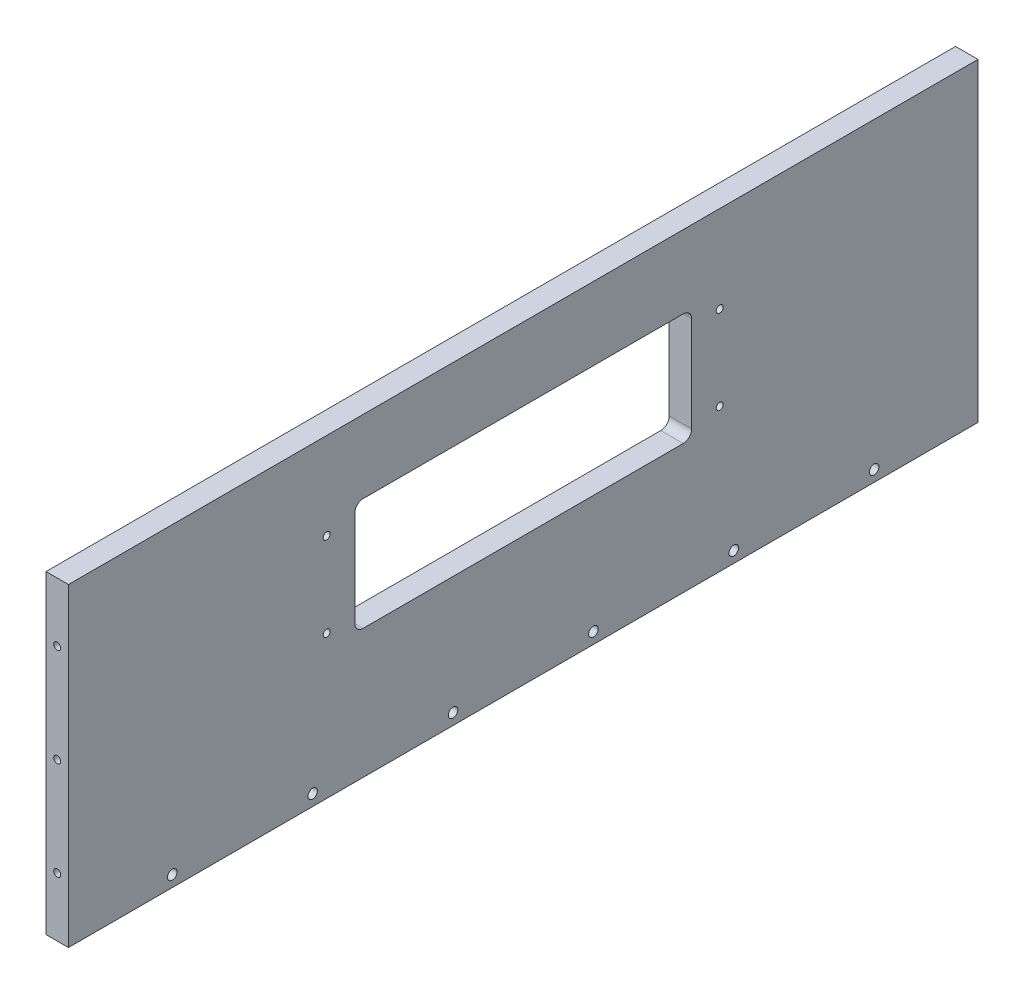
ISO-10303-21;
HEADER;
FILE_DESCRIPTION(('STEP AP214'),'2;1');
FILE_NAME('part.step','',(''),(''),'','','');
FILE_SCHEMA(('AUTOMOTIVE_DESIGN { 1 0 10303 214 1 1 1 1 }'));
ENDSEC;
DATA;
#1=APPLICATION_CONTEXT('core data for automotive mechanical design processes');
#2=APPLICATION_PROTOCOL_DEFINITION('international standard','automotive_design',2000,#1);
#3=PRODUCT_CONTEXT('',#1,'mechanical');
#4=PRODUCT('Part','Part','',(#3));
#5=PRODUCT_RELATED_PRODUCT_CATEGORY('part','',(#4));
#6=PRODUCT_DEFINITION_FORMATION('','',#4);
#7=PRODUCT_DEFINITION_CONTEXT('part definition',#1,'design');
#8=PRODUCT_DEFINITION('design','',#6,#7);
#9=PRODUCT_DEFINITION_SHAPE('','',#8);
#10=(LENGTH_UNIT() NAMED_UNIT(*) SI_UNIT(.MILLI.,.METRE.));
#11=(NAMED_UNIT(*) PLANE_ANGLE_UNIT() SI_UNIT($,.RADIAN.));
#12=(NAMED_UNIT(*) SI_UNIT($,.STERADIAN.) SOLID_ANGLE_UNIT());
#13=UNCERTAINTY_MEASURE_WITH_UNIT(LENGTH_MEASURE(1.E-05),#10,'distance_accuracy_value','');
#14=(GEOMETRIC_REPRESENTATION_CONTEXT(3) GLOBAL_UNCERTAINTY_ASSIGNED_CONTEXT((#13)) GLOBAL_UNIT_ASSIGNED_CONTEXT((#10,
#11,#12)) REPRESENTATION_CONTEXT('',''));
#15=CARTESIAN_POINT('',(0.,0.,0.));
#16=DIRECTION('',(0.,0.,1.));
#17=DIRECTION('',(1.,0.,0.));
#18=AXIS2_PLACEMENT_3D('',#15,#16,#17);
#19=CARTESIAN_POINT('',(0.,0.,0.));
#20=DIRECTION('',(1.,0.,0.));
#21=DIRECTION('',(0.,0.,-1.));
#22=AXIS2_PLACEMENT_3D('',#19,#20,#21);
#23=PLANE('',#22);
#24=CARTESIAN_POINT('',(0.,-5.00000000000001,70.));
#25=DIRECTION('',(-1.,0.,0.));
#26=DIRECTION('',(0.,0.,1.));
#27=AXIS2_PLACEMENT_3D('',#24,#25,#26);
#28=CIRCLE('',#27,1.25);
#29=CARTESIAN_POINT('',(0.,-5.00000000000001,71.25));
#30=VERTEX_POINT('',#29);
#31=EDGE_CURVE('E385',#30,#30,#28,.T.);
#32=ORIENTED_EDGE('',*,*,#31,.F.);
#33=EDGE_LOOP('',(#32));
#34=FACE_BOUND('',#33,.T.);
#35=CARTESIAN_POINT('',(0.,25.,-70.));
#36=DIRECTION('',(-1.,0.,0.));
#37=DIRECTION('',(0.,0.,1.));
#38=AXIS2_PLACEMENT_3D('',#35,#36,#37);
#39=CIRCLE('',#38,1.25);
#40=CARTESIAN_POINT('',(0.,25.,-68.75));
#41=VERTEX_POINT('',#40);
#42=EDGE_CURVE('E393',#41,#41,#39,.T.);
#43=ORIENTED_EDGE('',*,*,#42,.F.);
#44=EDGE_LOOP('',(#43));
#45=FACE_BOUND('',#44,.T.);
#46=DIRECTION('',(0.,0.,1.));
#47=VECTOR('',#46,1.);
#48=CARTESIAN_POINT('',(0.,-10.,60.));
#49=LINE('',#48,#47);
#50=CARTESIAN_POINT('',(0.,-10.,-57.));
#51=VERTEX_POINT('',#50);
#52=CARTESIAN_POINT('',(0.,-10.,57.));
#53=VERTEX_POINT('',#52);
#54=EDGE_CURVE('E327',#51,#53,#49,.T.);
#55=ORIENTED_EDGE('',*,*,#54,.F.);
#56=CARTESIAN_POINT('',(0.,-7.00000000000001,-57.));
#57=DIRECTION('',(1.,0.,0.));
#58=DIRECTION('',(0.,0.,-1.));
#59=AXIS2_PLACEMENT_3D('',#56,#57,#58);
#60=CIRCLE('',#59,3.);
#61=CARTESIAN_POINT('',(0.,-7.00000000000001,-60.));
#62=VERTEX_POINT('',#61);
#63=EDGE_CURVE('E279',#51,#62,#60,.T.);
#64=ORIENTED_EDGE('',*,*,#63,.T.);
#65=DIRECTION('',(0.,-1.,0.));
#66=VECTOR('',#65,1.);
#67=CARTESIAN_POINT('',(0.,-10.,-60.));
#68=LINE('',#67,#66);
#69=CARTESIAN_POINT('',(0.,27.,-60.));
#70=VERTEX_POINT('',#69);
#71=EDGE_CURVE('E296',#70,#62,#68,.T.);
#72=ORIENTED_EDGE('',*,*,#71,.F.);
#73=CARTESIAN_POINT('',(0.,27.,-57.));
#74=DIRECTION('',(1.,0.,0.));
#75=DIRECTION('',(0.,0.,-1.));
#76=AXIS2_PLACEMENT_3D('',#73,#74,#75);
#77=CIRCLE('',#76,3.);
#78=CARTESIAN_POINT('',(0.,30.,-57.));
#79=VERTEX_POINT('',#78);
#80=EDGE_CURVE('E57',#70,#79,#77,.T.);
#81=ORIENTED_EDGE('',*,*,#80,.T.);
#82=DIRECTION('',(0.,0.,-1.));
#83=VECTOR('',#82,1.);
#84=CARTESIAN_POINT('',(0.,30.,60.));
#85=LINE('',#84,#83);
#86=CARTESIAN_POINT('',(0.,30.,57.));
#87=VERTEX_POINT('',#86);
#88=EDGE_CURVE('E294',#87,#79,#85,.T.);
#89=ORIENTED_EDGE('',*,*,#88,.F.);
#90=CARTESIAN_POINT('',(0.,27.,57.));
#91=DIRECTION('',(1.,0.,0.));
#92=DIRECTION('',(0.,0.,-1.));
#93=AXIS2_PLACEMENT_3D('',#90,#91,#92);
#94=CIRCLE('',#93,3.);
#95=CARTESIAN_POINT('',(0.,27.,60.));
#96=VERTEX_POINT('',#95);
#97=EDGE_CURVE('E287',#87,#96,#94,.T.);
#98=ORIENTED_EDGE('',*,*,#97,.T.);
#99=DIRECTION('',(0.,1.,0.));
#100=VECTOR('',#99,1.);
#101=CARTESIAN_POINT('',(0.,-10.,60.));
#102=LINE('',#101,#100);
#103=CARTESIAN_POINT('',(0.,-7.,60.));
#104=VERTEX_POINT('',#103);
#105=EDGE_CURVE('E302',#104,#96,#102,.T.);
#106=ORIENTED_EDGE('',*,*,#105,.F.);
#107=CARTESIAN_POINT('',(0.,-7.,57.));
#108=DIRECTION('',(1.,0.,0.));
#109=DIRECTION('',(0.,0.,-1.));
#110=AXIS2_PLACEMENT_3D('',#107,#108,#109);
#111=CIRCLE('',#110,3.);
#112=EDGE_CURVE('E283',#104,#53,#111,.T.);
#113=ORIENTED_EDGE('',*,*,#112,.T.);
#114=EDGE_LOOP('',(#55,#64,#72,#81,#89,#98,#106,#113));
#115=FACE_BOUND('',#114,.T.);
#116=CARTESIAN_POINT('',(0.,-52.,-125.));
#117=DIRECTION('',(-1.,0.,0.));
#118=DIRECTION('',(0.,0.,1.));
#119=AXIS2_PLACEMENT_3D('',#116,#117,#118);
#120=CIRCLE('',#119,3.15);
#121=CARTESIAN_POINT('',(0.,-52.,-121.85));
#122=VERTEX_POINT('',#121);
#123=EDGE_CURVE('E325',#122,#122,#120,.T.);
#124=ORIENTED_EDGE('',*,*,#123,.F.);
#125=EDGE_LOOP('',(#124));
#126=FACE_BOUND('',#125,.T.);
#127=CARTESIAN_POINT('',(0.,-52.,-75.));
#128=DIRECTION('',(-1.,0.,0.));
#129=DIRECTION('',(0.,0.,1.));
#130=AXIS2_PLACEMENT_3D('',#127,#128,#129);
#131=CIRCLE('',#130,3.15);
#132=CARTESIAN_POINT('',(0.,-52.,-71.85));
#133=VERTEX_POINT('',#132);
#134=EDGE_CURVE('E259',#133,#133,#131,.T.);
#135=ORIENTED_EDGE('',*,*,#134,.F.);
#136=EDGE_LOOP('',(#135));
#137=FACE_BOUND('',#136,.T.);
#138=CARTESIAN_POINT('',(0.,-52.,-25.));
#139=DIRECTION('',(-1.,0.,0.));
#140=DIRECTION('',(0.,0.,1.));
#141=AXIS2_PLACEMENT_3D('',#138,#139,#140);
#142=CIRCLE('',#141,3.15);
#143=CARTESIAN_POINT('',(0.,-52.,-21.85));
#144=VERTEX_POINT('',#143);
#145=EDGE_CURVE('E254',#144,#144,#142,.T.);
#146=ORIENTED_EDGE('',*,*,#145,.F.);
#147=EDGE_LOOP('',(#146));
#148=FACE_BOUND('',#147,.T.);
#149=CARTESIAN_POINT('',(0.,-51.9999999999999,75.));
#150=DIRECTION('',(-1.,0.,0.));
#151=DIRECTION('',(0.,0.,1.));
#152=AXIS2_PLACEMENT_3D('',#149,#150,#151);
#153=CIRCLE('',#152,3.15);
#154=CARTESIAN_POINT('',(0.,-51.9999999999999,78.15));
#155=VERTEX_POINT('',#154);
#156=EDGE_CURVE('E244',#155,#155,#153,.T.);
#157=ORIENTED_EDGE('',*,*,#156,.F.);
#158=EDGE_LOOP('',(#157));
#159=FACE_BOUND('',#158,.T.);
#160=CARTESIAN_POINT('',(0.,-51.9999999999999,125.));
#161=DIRECTION('',(-1.,0.,0.));
#162=DIRECTION('',(0.,0.,1.));
#163=AXIS2_PLACEMENT_3D('',#160,#161,#162);
#164=CIRCLE('',#163,3.15);
#165=CARTESIAN_POINT('',(0.,-51.9999999999999,128.15));
#166=VERTEX_POINT('',#165);
#167=EDGE_CURVE('E239',#166,#166,#164,.T.);
#168=ORIENTED_EDGE('',*,*,#167,.F.);
#169=EDGE_LOOP('',(#168));
#170=FACE_BOUND('',#169,.T.);
#171=DIRECTION('',(0.,-1.,0.));
#172=VECTOR('',#171,1.);
#173=CARTESIAN_POINT('',(0.,-56.,162.));
#174=LINE('',#173,#172);
#175=CARTESIAN_POINT('',(0.,56.,162.));
#176=VERTEX_POINT('',#175);
#177=CARTESIAN_POINT('',(0.,-56.,162.));
#178=VERTEX_POINT('',#177);
#179=EDGE_CURVE('E202',#176,#178,#174,.T.);
#180=ORIENTED_EDGE('',*,*,#179,.F.);
#181=DIRECTION('',(0.,0.,1.));
#182=VECTOR('',#181,1.);
#183=CARTESIAN_POINT('',(0.,56.,-162.));
#184=LINE('',#183,#182);
#185=CARTESIAN_POINT('',(0.,56.,-162.));
#186=VERTEX_POINT('',#185);
#187=EDGE_CURVE('E207',#186,#176,#184,.T.);
#188=ORIENTED_EDGE('',*,*,#187,.F.);
#189=DIRECTION('',(0.,1.,0.));
#190=VECTOR('',#189,1.);
#191=CARTESIAN_POINT('',(0.,-56.,-162.));
#192=LINE('',#191,#190);
#193=CARTESIAN_POINT('',(0.,-56.,-162.));
#194=VERTEX_POINT('',#193);
#195=EDGE_CURVE('E218',#194,#186,#192,.T.);
#196=ORIENTED_EDGE('',*,*,#195,.F.);
#197=DIRECTION('',(0.,0.,-1.));
#198=VECTOR('',#197,1.);
#199=CARTESIAN_POINT('',(0.,-56.,-162.));
#200=LINE('',#199,#198);
#201=EDGE_CURVE('E216',#178,#194,#200,.T.);
#202=ORIENTED_EDGE('',*,*,#201,.F.);
#203=EDGE_LOOP('',(#180,#188,#196,#202));
#204=FACE_BOUND('',#203,.T.);
#205=CARTESIAN_POINT('',(0.,-52.,25.));
#206=DIRECTION('',(-1.,0.,0.));
#207=DIRECTION('',(0.,0.,1.));
#208=AXIS2_PLACEMENT_3D('',#205,#206,#207);
#209=CIRCLE('',#208,3.15);
#210=CARTESIAN_POINT('',(0.,-52.,28.15));
#211=VERTEX_POINT('',#210);
#212=EDGE_CURVE('E249',#211,#211,#209,.T.);
#213=ORIENTED_EDGE('',*,*,#212,.F.);
#214=EDGE_LOOP('',(#213));
#215=FACE_BOUND('',#214,.T.);
#216=CARTESIAN_POINT('',(0.,-5.00000000000001,-70.));
#217=DIRECTION('',(-1.,0.,0.));
#218=DIRECTION('',(0.,0.,1.));
#219=AXIS2_PLACEMENT_3D('',#216,#217,#218);
#220=CIRCLE('',#219,1.25);
#221=CARTESIAN_POINT('',(0.,-5.00000000000001,-68.75));
#222=VERTEX_POINT('',#221);
#223=EDGE_CURVE('E377',#222,#222,#220,.T.);
#224=ORIENTED_EDGE('',*,*,#223,.F.);
#225=EDGE_LOOP('',(#224));
#226=FACE_BOUND('',#225,.T.);
#227=CARTESIAN_POINT('',(0.,25.,70.));
#228=DIRECTION('',(-1.,0.,0.));
#229=DIRECTION('',(0.,0.,1.));
#230=AXIS2_PLACEMENT_3D('',#227,#228,#229);
#231=CIRCLE('',#230,1.25);
#232=CARTESIAN_POINT('',(0.,25.,71.25));
#233=VERTEX_POINT('',#232);
#234=EDGE_CURVE('E380',#233,#233,#231,.T.);
#235=ORIENTED_EDGE('',*,*,#234,.F.);
#236=EDGE_LOOP('',(#235));
#237=FACE_BOUND('',#236,.T.);
#238=ADVANCED_FACE('F49',(#34,#45,#115,#126,#137,#148,#159,#170,#204,#215,#226,#237),#23,.F.);
#239=CARTESIAN_POINT('',(8.,0.,0.));
#240=DIRECTION('',(1.,0.,0.));
#241=DIRECTION('',(0.,0.,-1.));
#242=AXIS2_PLACEMENT_3D('',#239,#240,#241);
#243=PLANE('',#242);
#244=CARTESIAN_POINT('',(8.,-5.00000000000001,-70.));
#245=DIRECTION('',(-1.,0.,0.));
#246=DIRECTION('',(0.,0.,1.));
#247=AXIS2_PLACEMENT_3D('',#244,#245,#246);
#248=CIRCLE('',#247,1.25);
#249=CARTESIAN_POINT('',(8.,-5.00000000000001,-68.75));
#250=VERTEX_POINT('',#249);
#251=EDGE_CURVE('E320',#250,#250,#248,.T.);
#252=ORIENTED_EDGE('',*,*,#251,.T.);
#253=EDGE_LOOP('',(#252));
#254=FACE_BOUND('',#253,.T.);
#255=DIRECTION('',(0.,0.,-1.));
#256=VECTOR('',#255,1.);
#257=CARTESIAN_POINT('',(8.,30.,60.));
#258=LINE('',#257,#256);
#259=CARTESIAN_POINT('',(8.,30.,57.));
#260=VERTEX_POINT('',#259);
#261=CARTESIAN_POINT('',(8.,30.,-57.));
#262=VERTEX_POINT('',#261);
#263=EDGE_CURVE('E310',#260,#262,#258,.T.);
#264=ORIENTED_EDGE('',*,*,#263,.T.);
#265=CARTESIAN_POINT('',(8.,27.,-57.));
#266=DIRECTION('',(1.,0.,0.));
#267=DIRECTION('',(0.,0.,-1.));
#268=AXIS2_PLACEMENT_3D('',#265,#266,#267);
#269=CIRCLE('',#268,3.);
#270=CARTESIAN_POINT('',(8.,27.,-60.));
#271=VERTEX_POINT('',#270);
#272=EDGE_CURVE('E13',#262,#271,#269,.F.);
#273=ORIENTED_EDGE('',*,*,#272,.T.);
#274=DIRECTION('',(0.,-1.,0.));
#275=VECTOR('',#274,1.);
#276=CARTESIAN_POINT('',(8.,-10.,-60.));
#277=LINE('',#276,#275);
#278=CARTESIAN_POINT('',(8.,-7.00000000000001,-60.));
#279=VERTEX_POINT('',#278);
#280=EDGE_CURVE('E301',#271,#279,#277,.T.);
#281=ORIENTED_EDGE('',*,*,#280,.T.);
#282=CARTESIAN_POINT('',(8.,-7.00000000000001,-57.));
#283=DIRECTION('',(1.,0.,0.));
#284=DIRECTION('',(0.,0.,-1.));
#285=AXIS2_PLACEMENT_3D('',#282,#283,#284);
#286=CIRCLE('',#285,3.);
#287=CARTESIAN_POINT('',(8.,-10.,-57.));
#288=VERTEX_POINT('',#287);
#289=EDGE_CURVE('E281',#279,#288,#286,.F.);
#290=ORIENTED_EDGE('',*,*,#289,.T.);
#291=DIRECTION('',(0.,0.,1.));
#292=VECTOR('',#291,1.);
#293=CARTESIAN_POINT('',(8.,-10.,60.));
#294=LINE('',#293,#292);
#295=CARTESIAN_POINT('',(8.,-10.,57.));
#296=VERTEX_POINT('',#295);
#297=EDGE_CURVE('E314',#288,#296,#294,.T.);
#298=ORIENTED_EDGE('',*,*,#297,.T.);
#299=CARTESIAN_POINT('',(8.,-7.,57.));
#300=DIRECTION('',(1.,0.,0.));
#301=DIRECTION('',(0.,0.,-1.));
#302=AXIS2_PLACEMENT_3D('',#299,#300,#301);
#303=CIRCLE('',#302,3.);
#304=CARTESIAN_POINT('',(8.,-7.,60.));
#305=VERTEX_POINT('',#304);
#306=EDGE_CURVE('E285',#296,#305,#303,.F.);
#307=ORIENTED_EDGE('',*,*,#306,.T.);
#308=DIRECTION('',(0.,1.,0.));
#309=VECTOR('',#308,1.);
#310=CARTESIAN_POINT('',(8.,-10.,60.));
#311=LINE('',#310,#309);
#312=CARTESIAN_POINT('',(8.,27.,60.));
#313=VERTEX_POINT('',#312);
#314=EDGE_CURVE('E317',#305,#313,#311,.T.);
#315=ORIENTED_EDGE('',*,*,#314,.T.);
#316=CARTESIAN_POINT('',(8.,27.,57.));
#317=DIRECTION('',(1.,0.,0.));
#318=DIRECTION('',(0.,0.,-1.));
#319=AXIS2_PLACEMENT_3D('',#316,#317,#318);
#320=CIRCLE('',#319,3.);
#321=EDGE_CURVE('E71',#313,#260,#320,.F.);
#322=ORIENTED_EDGE('',*,*,#321,.T.);
#323=EDGE_LOOP('',(#264,#273,#281,#290,#298,#307,#315,#322));
#324=FACE_BOUND('',#323,.T.);
#325=CARTESIAN_POINT('',(8.,-52.,-125.));
#326=DIRECTION('',(1.,0.,0.));
#327=DIRECTION('',(0.,0.,-1.));
#328=AXIS2_PLACEMENT_3D('',#325,#326,#327);
#329=CIRCLE('',#328,1.7);
#330=CARTESIAN_POINT('',(8.,-52.,-126.7));
#331=VERTEX_POINT('',#330);
#332=EDGE_CURVE('E256',#331,#331,#329,.T.);
#333=ORIENTED_EDGE('',*,*,#332,.F.);
#334=EDGE_LOOP('',(#333));
#335=FACE_BOUND('',#334,.T.);
#336=CARTESIAN_POINT('',(8.,-52.,-75.));
#337=DIRECTION('',(1.,0.,0.));
#338=DIRECTION('',(0.,0.,-1.));
#339=AXIS2_PLACEMENT_3D('',#336,#337,#338);
#340=CIRCLE('',#339,1.7);
#341=CARTESIAN_POINT('',(8.,-52.,-76.7));
#342=VERTEX_POINT('',#341);
#343=EDGE_CURVE('E251',#342,#342,#340,.T.);
#344=ORIENTED_EDGE('',*,*,#343,.F.);
#345=EDGE_LOOP('',(#344));
#346=FACE_BOUND('',#345,.T.);
#347=CARTESIAN_POINT('',(8.,-52.,-25.));
#348=DIRECTION('',(1.,0.,0.));
#349=DIRECTION('',(0.,0.,-1.));
#350=AXIS2_PLACEMENT_3D('',#347,#348,#349);
#351=CIRCLE('',#350,1.7);
#352=CARTESIAN_POINT('',(8.,-52.,-26.7));
#353=VERTEX_POINT('',#352);
#354=EDGE_CURVE('E246',#353,#353,#351,.T.);
#355=ORIENTED_EDGE('',*,*,#354,.F.);
#356=EDGE_LOOP('',(#355));
#357=FACE_BOUND('',#356,.T.);
#358=CARTESIAN_POINT('',(8.,-52.,25.));
#359=DIRECTION('',(1.,0.,0.));
#360=DIRECTION('',(0.,0.,-1.));
#361=AXIS2_PLACEMENT_3D('',#358,#359,#360);
#362=CIRCLE('',#361,1.7);
#363=CARTESIAN_POINT('',(8.,-52.,23.3));
#364=VERTEX_POINT('',#363);
#365=EDGE_CURVE('E241',#364,#364,#362,.T.);
#366=ORIENTED_EDGE('',*,*,#365,.F.);
#367=EDGE_LOOP('',(#366));
#368=FACE_BOUND('',#367,.T.);
#369=CARTESIAN_POINT('',(8.,-51.9999999999999,75.));
#370=DIRECTION('',(1.,0.,0.));
#371=DIRECTION('',(0.,0.,-1.));
#372=AXIS2_PLACEMENT_3D('',#369,#370,#371);
#373=CIRCLE('',#372,1.7);
#374=CARTESIAN_POINT('',(8.,-51.9999999999999,73.3));
#375=VERTEX_POINT('',#374);
#376=EDGE_CURVE('E236',#375,#375,#373,.T.);
#377=ORIENTED_EDGE('',*,*,#376,.F.);
#378=EDGE_LOOP('',(#377));
#379=FACE_BOUND('',#378,.T.);
#380=CARTESIAN_POINT('',(8.,-51.9999999999999,125.));
#381=DIRECTION('',(1.,0.,0.));
#382=DIRECTION('',(0.,0.,-1.));
#383=AXIS2_PLACEMENT_3D('',#380,#381,#382);
#384=CIRCLE('',#383,1.7);
#385=CARTESIAN_POINT('',(8.,-51.9999999999999,123.3));
#386=VERTEX_POINT('',#385);
#387=EDGE_CURVE('E172',#386,#386,#384,.T.);
#388=ORIENTED_EDGE('',*,*,#387,.F.);
#389=EDGE_LOOP('',(#388));
#390=FACE_BOUND('',#389,.T.);
#391=DIRECTION('',(0.,-1.,0.));
#392=VECTOR('',#391,1.);
#393=CARTESIAN_POINT('',(8.,-56.,162.));
#394=LINE('',#393,#392);
#395=CARTESIAN_POINT('',(8.,56.,162.));
#396=VERTEX_POINT('',#395);
#397=CARTESIAN_POINT('',(8.,-56.,162.));
#398=VERTEX_POINT('',#397);
#399=EDGE_CURVE('E203',#396,#398,#394,.T.);
#400=ORIENTED_EDGE('',*,*,#399,.T.);
#401=DIRECTION('',(0.,0.,-1.));
#402=VECTOR('',#401,1.);
#403=CARTESIAN_POINT('',(8.,-56.,-162.));
#404=LINE('',#403,#402);
#405=CARTESIAN_POINT('',(8.,-56.,-162.));
#406=VERTEX_POINT('',#405);
#407=EDGE_CURVE('E206',#398,#406,#404,.T.);
#408=ORIENTED_EDGE('',*,*,#407,.T.);
#409=DIRECTION('',(0.,1.,0.));
#410=VECTOR('',#409,1.);
#411=CARTESIAN_POINT('',(8.,-56.,-162.));
#412=LINE('',#411,#410);
#413=CARTESIAN_POINT('',(8.,56.,-162.));
#414=VERTEX_POINT('',#413);
#415=EDGE_CURVE('E209',#406,#414,#412,.T.);
#416=ORIENTED_EDGE('',*,*,#415,.T.);
#417=DIRECTION('',(0.,0.,1.));
#418=VECTOR('',#417,1.);
#419=CARTESIAN_POINT('',(8.,56.,-162.));
#420=LINE('',#419,#418);
#421=EDGE_CURVE('E211',#414,#396,#420,.T.);
#422=ORIENTED_EDGE('',*,*,#421,.T.);
#423=EDGE_LOOP('',(#400,#408,#416,#422));
#424=FACE_BOUND('',#423,.T.);
#425=CARTESIAN_POINT('',(8.,25.,-70.));
#426=DIRECTION('',(-1.,0.,0.));
#427=DIRECTION('',(0.,0.,1.));
#428=AXIS2_PLACEMENT_3D('',#425,#426,#427);
#429=CIRCLE('',#428,1.25);
#430=CARTESIAN_POINT('',(8.,25.,-68.75));
#431=VERTEX_POINT('',#430);
#432=EDGE_CURVE('E396',#431,#431,#429,.T.);
#433=ORIENTED_EDGE('',*,*,#432,.T.);
#434=EDGE_LOOP('',(#433));
#435=FACE_BOUND('',#434,.T.);
#436=CARTESIAN_POINT('',(8.,-5.00000000000001,70.));
#437=DIRECTION('',(-1.,0.,0.));
#438=DIRECTION('',(0.,0.,1.));
#439=AXIS2_PLACEMENT_3D('',#436,#437,#438);
#440=CIRCLE('',#439,1.25);
#441=CARTESIAN_POINT('',(8.,-5.00000000000001,71.25));
#442=VERTEX_POINT('',#441);
#443=EDGE_CURVE('E390',#442,#442,#440,.T.);
#444=ORIENTED_EDGE('',*,*,#443,.T.);
#445=EDGE_LOOP('',(#444));
#446=FACE_BOUND('',#445,.T.);
#447=CARTESIAN_POINT('',(8.,25.,70.));
#448=DIRECTION('',(-1.,0.,0.));
#449=DIRECTION('',(0.,0.,1.));
#450=AXIS2_PLACEMENT_3D('',#447,#448,#449);
#451=CIRCLE('',#450,1.25);
#452=CARTESIAN_POINT('',(8.,25.,71.25));
#453=VERTEX_POINT('',#452);
#454=EDGE_CURVE('E382',#453,#453,#451,.T.);
#455=ORIENTED_EDGE('',*,*,#454,.T.);
#456=EDGE_LOOP('',(#455));
#457=FACE_BOUND('',#456,.T.);
#458=ADVANCED_FACE('F307',(#254,#324,#335,#346,#357,#368,#379,#390,#424,#435,#446,#457),#243,.T.);
#459=CARTESIAN_POINT('',(8.,-56.,162.));
#460=DIRECTION('',(0.,0.,-1.));
#461=DIRECTION('',(-1.,0.,0.));
#462=AXIS2_PLACEMENT_3D('',#459,#460,#461);
#463=PLANE('',#462);
#464=CARTESIAN_POINT('',(4.,35.,162.));
#465=DIRECTION('',(0.,0.,1.));
#466=DIRECTION('',(1.,0.,0.));
#467=AXIS2_PLACEMENT_3D('',#464,#465,#466);
#468=CIRCLE('',#467,1.24999999999999);
#469=CARTESIAN_POINT('',(5.24999999999999,35.,162.));
#470=VERTEX_POINT('',#469);
#471=EDGE_CURVE('E184',#470,#470,#468,.T.);
#472=ORIENTED_EDGE('',*,*,#471,.F.);
#473=EDGE_LOOP('',(#472));
#474=FACE_BOUND('',#473,.T.);
#475=CARTESIAN_POINT('',(4.,0.,162.));
#476=DIRECTION('',(0.,0.,1.));
#477=DIRECTION('',(1.,0.,0.));
#478=AXIS2_PLACEMENT_3D('',#475,#476,#477);
#479=CIRCLE('',#478,1.24999999999999);
#480=CARTESIAN_POINT('',(5.24999999999999,0.,162.));
#481=VERTEX_POINT('',#480);
#482=EDGE_CURVE('E190',#481,#481,#479,.T.);
#483=ORIENTED_EDGE('',*,*,#482,.F.);
#484=EDGE_LOOP('',(#483));
#485=FACE_BOUND('',#484,.T.);
#486=CARTESIAN_POINT('',(4.,-35.,162.));
#487=DIRECTION('',(0.,0.,1.));
#488=DIRECTION('',(1.,0.,0.));
#489=AXIS2_PLACEMENT_3D('',#486,#487,#488);
#490=CIRCLE('',#489,1.24999999999999);
#491=CARTESIAN_POINT('',(5.24999999999999,-35.,162.));
#492=VERTEX_POINT('',#491);
#493=EDGE_CURVE('E196',#492,#492,#490,.T.);
#494=ORIENTED_EDGE('',*,*,#493,.F.);
#495=EDGE_LOOP('',(#494));
#496=FACE_BOUND('',#495,.T.);
#497=ORIENTED_EDGE('',*,*,#179,.T.);
#498=DIRECTION('',(-1.,0.,0.));
#499=VECTOR('',#498,1.);
#500=CARTESIAN_POINT('',(8.,-56.,162.));
#501=LINE('',#500,#499);
#502=EDGE_CURVE('E229',#398,#178,#501,.T.);
#503=ORIENTED_EDGE('',*,*,#502,.F.);
#504=ORIENTED_EDGE('',*,*,#399,.F.);
#505=DIRECTION('',(-1.,0.,0.));
#506=VECTOR('',#505,1.);
#507=CARTESIAN_POINT('',(8.,56.,162.));
#508=LINE('',#507,#506);
#509=EDGE_CURVE('E213',#396,#176,#508,.T.);
#510=ORIENTED_EDGE('',*,*,#509,.T.);
#511=EDGE_LOOP('',(#497,#503,#504,#510));
#512=FACE_BOUND('',#511,.T.);
#513=ADVANCED_FACE('F512',(#474,#485,#496,#512),#463,.F.);
#514=CARTESIAN_POINT('',(8.,-56.,-162.));
#515=DIRECTION('',(0.,1.,0.));
#516=DIRECTION('',(0.,0.,1.));
#517=AXIS2_PLACEMENT_3D('',#514,#515,#516);
#518=PLANE('',#517);
#519=ORIENTED_EDGE('',*,*,#201,.T.);
#520=DIRECTION('',(-1.,0.,0.));
#521=VECTOR('',#520,1.);
#522=CARTESIAN_POINT('',(8.,-56.,-162.));
#523=LINE('',#522,#521);
#524=EDGE_CURVE('E226',#406,#194,#523,.T.);
#525=ORIENTED_EDGE('',*,*,#524,.F.);
#526=ORIENTED_EDGE('',*,*,#407,.F.);
#527=ORIENTED_EDGE('',*,*,#502,.T.);
#528=EDGE_LOOP('',(#519,#525,#526,#527));
#529=FACE_BOUND('',#528,.T.);
#530=ADVANCED_FACE('F520',(#529),#518,.F.);
#531=CARTESIAN_POINT('',(8.,-56.,-162.));
#532=DIRECTION('',(0.,0.,1.));
#533=DIRECTION('',(1.,0.,0.));
#534=AXIS2_PLACEMENT_3D('',#531,#532,#533);
#535=PLANE('',#534);
#536=CARTESIAN_POINT('',(4.,35.,-162.));
#537=DIRECTION('',(0.,0.,-1.));
#538=DIRECTION('',(-1.,0.,0.));
#539=AXIS2_PLACEMENT_3D('',#536,#537,#538);
#540=CIRCLE('',#539,1.24999999999999);
#541=CARTESIAN_POINT('',(2.75000000000001,35.,-162.));
#542=VERTEX_POINT('',#541);
#543=EDGE_CURVE('E166',#542,#542,#540,.T.);
#544=ORIENTED_EDGE('',*,*,#543,.F.);
#545=EDGE_LOOP('',(#544));
#546=FACE_BOUND('',#545,.T.);
#547=CARTESIAN_POINT('',(4.,0.,-162.));
#548=DIRECTION('',(0.,0.,-1.));
#549=DIRECTION('',(-1.,0.,0.));
#550=AXIS2_PLACEMENT_3D('',#547,#548,#549);
#551=CIRCLE('',#550,1.24999999999999);
#552=CARTESIAN_POINT('',(2.75000000000001,0.,-162.));
#553=VERTEX_POINT('',#552);
#554=EDGE_CURVE('E165',#553,#553,#551,.T.);
#555=ORIENTED_EDGE('',*,*,#554,.F.);
#556=EDGE_LOOP('',(#555));
#557=FACE_BOUND('',#556,.T.);
#558=CARTESIAN_POINT('',(4.,-35.,-162.));
#559=DIRECTION('',(0.,0.,-1.));
#560=DIRECTION('',(-1.,0.,0.));
#561=AXIS2_PLACEMENT_3D('',#558,#559,#560);
#562=CIRCLE('',#561,1.24999999999999);
#563=CARTESIAN_POINT('',(2.75000000000001,-35.,-162.));
#564=VERTEX_POINT('',#563);
#565=EDGE_CURVE('E178',#564,#564,#562,.T.);
#566=ORIENTED_EDGE('',*,*,#565,.F.);
#567=EDGE_LOOP('',(#566));
#568=FACE_BOUND('',#567,.T.);
#569=ORIENTED_EDGE('',*,*,#195,.T.);
#570=DIRECTION('',(-1.,0.,0.));
#571=VECTOR('',#570,1.);
#572=CARTESIAN_POINT('',(8.,56.,-162.));
#573=LINE('',#572,#571);
#574=EDGE_CURVE('E223',#414,#186,#573,.T.);
#575=ORIENTED_EDGE('',*,*,#574,.F.);
#576=ORIENTED_EDGE('',*,*,#415,.F.);
#577=ORIENTED_EDGE('',*,*,#524,.T.);
#578=EDGE_LOOP('',(#569,#575,#576,#577));
#579=FACE_BOUND('',#578,.T.);
#580=ADVANCED_FACE('F516',(#546,#557,#568,#579),#535,.F.);
#581=CARTESIAN_POINT('',(8.,56.,-162.));
#582=DIRECTION('',(0.,-1.,0.));
#583=DIRECTION('',(0.,0.,-1.));
#584=AXIS2_PLACEMENT_3D('',#581,#582,#583);
#585=PLANE('',#584);
#586=ORIENTED_EDGE('',*,*,#187,.T.);
#587=ORIENTED_EDGE('',*,*,#509,.F.);
#588=ORIENTED_EDGE('',*,*,#421,.F.);
#589=ORIENTED_EDGE('',*,*,#574,.T.);
#590=EDGE_LOOP('',(#586,#587,#588,#589));
#591=FACE_BOUND('',#590,.T.);
#592=ADVANCED_FACE('F509',(#591),#585,.F.);
#593=CARTESIAN_POINT('',(4.,-35.,150.5));
#594=DIRECTION('',(0.,0.,1.));
#595=DIRECTION('',(1.,0.,0.));
#596=AXIS2_PLACEMENT_3D('',#593,#594,#595);
#597=CONICAL_SURFACE('',#596,1.24999999999999,1.02974425867664);
#598=CARTESIAN_POINT('',(4.,-35.,149.748924226216));
#599=VERTEX_POINT('',#598);
#600=VERTEX_LOOP('',#599);
#601=FACE_BOUND('',#600,.T.);
#602=CARTESIAN_POINT('',(4.,-35.,150.5));
#603=DIRECTION('',(0.,0.,1.));
#604=DIRECTION('',(1.,0.,0.));
#605=AXIS2_PLACEMENT_3D('',#602,#603,#604);
#606=CIRCLE('',#605,1.24999999999999);
#607=CARTESIAN_POINT('',(5.24999999999999,-35.,150.5));
#608=VERTEX_POINT('',#607);
#609=EDGE_CURVE('E199',#608,#608,#606,.T.);
#610=ORIENTED_EDGE('',*,*,#609,.T.);
#611=EDGE_LOOP('',(#610));
#612=FACE_BOUND('',#611,.T.);
#613=ADVANCED_FACE('F505',(#601,#612),#597,.F.);
#614=CARTESIAN_POINT('',(4.,-35.,162.));
#615=DIRECTION('',(0.,0.,1.));
#616=DIRECTION('',(1.,0.,0.));
#617=AXIS2_PLACEMENT_3D('',#614,#615,#616);
#618=CYLINDRICAL_SURFACE('',#617,1.24999999999999);
#619=ORIENTED_EDGE('',*,*,#609,.F.);
#620=EDGE_LOOP('',(#619));
#621=FACE_BOUND('',#620,.T.);
#622=ORIENTED_EDGE('',*,*,#493,.T.);
#623=EDGE_LOOP('',(#622));
#624=FACE_BOUND('',#623,.T.);
#625=ADVANCED_FACE('F501',(#621,#624),#618,.F.);
#626=CARTESIAN_POINT('',(4.,0.,150.5));
#627=DIRECTION('',(0.,0.,1.));
#628=DIRECTION('',(1.,0.,0.));
#629=AXIS2_PLACEMENT_3D('',#626,#627,#628);
#630=CONICAL_SURFACE('',#629,1.24999999999999,1.02974425867664);
#631=CARTESIAN_POINT('',(4.,0.,149.748924226216));
#632=VERTEX_POINT('',#631);
#633=VERTEX_LOOP('',#632);
#634=FACE_BOUND('',#633,.T.);
#635=CARTESIAN_POINT('',(4.,0.,150.5));
#636=DIRECTION('',(0.,0.,1.));
#637=DIRECTION('',(1.,0.,0.));
#638=AXIS2_PLACEMENT_3D('',#635,#636,#637);
#639=CIRCLE('',#638,1.24999999999999);
#640=CARTESIAN_POINT('',(5.24999999999999,0.,150.5));
#641=VERTEX_POINT('',#640);
#642=EDGE_CURVE('E193',#641,#641,#639,.T.);
#643=ORIENTED_EDGE('',*,*,#642,.T.);
#644=EDGE_LOOP('',(#643));
#645=FACE_BOUND('',#644,.T.);
#646=ADVANCED_FACE('F497',(#634,#645),#630,.F.);
#647=CARTESIAN_POINT('',(4.,0.,162.));
#648=DIRECTION('',(0.,0.,1.));
#649=DIRECTION('',(1.,0.,0.));
#650=AXIS2_PLACEMENT_3D('',#647,#648,#649);
#651=CYLINDRICAL_SURFACE('',#650,1.24999999999999);
#652=ORIENTED_EDGE('',*,*,#642,.F.);
#653=EDGE_LOOP('',(#652));
#654=FACE_BOUND('',#653,.T.);
#655=ORIENTED_EDGE('',*,*,#482,.T.);
#656=EDGE_LOOP('',(#655));
#657=FACE_BOUND('',#656,.T.);
#658=ADVANCED_FACE('F493',(#654,#657),#651,.F.);
#659=CARTESIAN_POINT('',(4.,35.,150.5));
#660=DIRECTION('',(0.,0.,1.));
#661=DIRECTION('',(1.,0.,0.));
#662=AXIS2_PLACEMENT_3D('',#659,#660,#661);
#663=CONICAL_SURFACE('',#662,1.24999999999999,1.02974425867664);
#664=CARTESIAN_POINT('',(4.,35.,149.748924226216));
#665=VERTEX_POINT('',#664);
#666=VERTEX_LOOP('',#665);
#667=FACE_BOUND('',#666,.T.);
#668=CARTESIAN_POINT('',(4.,35.,150.5));
#669=DIRECTION('',(0.,0.,1.));
#670=DIRECTION('',(1.,0.,0.));
#671=AXIS2_PLACEMENT_3D('',#668,#669,#670);
#672=CIRCLE('',#671,1.24999999999999);
#673=CARTESIAN_POINT('',(5.24999999999999,35.,150.5));
#674=VERTEX_POINT('',#673);
#675=EDGE_CURVE('E187',#674,#674,#672,.T.);
#676=ORIENTED_EDGE('',*,*,#675,.T.);
#677=EDGE_LOOP('',(#676));
#678=FACE_BOUND('',#677,.T.);
#679=ADVANCED_FACE('F489',(#667,#678),#663,.F.);
#680=CARTESIAN_POINT('',(4.,35.,162.));
#681=DIRECTION('',(0.,0.,1.));
#682=DIRECTION('',(1.,0.,0.));
#683=AXIS2_PLACEMENT_3D('',#680,#681,#682);
#684=CYLINDRICAL_SURFACE('',#683,1.24999999999999);
#685=ORIENTED_EDGE('',*,*,#675,.F.);
#686=EDGE_LOOP('',(#685));
#687=FACE_BOUND('',#686,.T.);
#688=ORIENTED_EDGE('',*,*,#471,.T.);
#689=EDGE_LOOP('',(#688));
#690=FACE_BOUND('',#689,.T.);
#691=ADVANCED_FACE('F485',(#687,#690),#684,.F.);
#692=CARTESIAN_POINT('',(4.,-35.,-150.5));
#693=DIRECTION('',(0.,0.,-1.));
#694=DIRECTION('',(-1.,0.,0.));
#695=AXIS2_PLACEMENT_3D('',#692,#693,#694);
#696=CONICAL_SURFACE('',#695,1.24999999999999,1.02974425867664);
#697=CARTESIAN_POINT('',(4.,-35.,-149.748924226216));
#698=VERTEX_POINT('',#697);
#699=VERTEX_LOOP('',#698);
#700=FACE_BOUND('',#699,.T.);
#701=CARTESIAN_POINT('',(4.,-35.,-150.5));
#702=DIRECTION('',(0.,0.,-1.));
#703=DIRECTION('',(-1.,0.,0.));
#704=AXIS2_PLACEMENT_3D('',#701,#702,#703);
#705=CIRCLE('',#704,1.24999999999999);
#706=CARTESIAN_POINT('',(2.75000000000002,-35.,-150.5));
#707=VERTEX_POINT('',#706);
#708=EDGE_CURVE('E181',#707,#707,#705,.T.);
#709=ORIENTED_EDGE('',*,*,#708,.T.);
#710=EDGE_LOOP('',(#709));
#711=FACE_BOUND('',#710,.T.);
#712=ADVANCED_FACE('F481',(#700,#711),#696,.F.);
#713=CARTESIAN_POINT('',(4.,-35.,-162.));
#714=DIRECTION('',(0.,0.,-1.));
#715=DIRECTION('',(-1.,0.,0.));
#716=AXIS2_PLACEMENT_3D('',#713,#714,#715);
#717=CYLINDRICAL_SURFACE('',#716,1.24999999999999);
#718=ORIENTED_EDGE('',*,*,#708,.F.);
#719=EDGE_LOOP('',(#718));
#720=FACE_BOUND('',#719,.T.);
#721=ORIENTED_EDGE('',*,*,#565,.T.);
#722=EDGE_LOOP('',(#721));
#723=FACE_BOUND('',#722,.T.);
#724=ADVANCED_FACE('F477',(#720,#723),#717,.F.);
#725=CARTESIAN_POINT('',(4.,0.,-150.5));
#726=DIRECTION('',(0.,0.,-1.));
#727=DIRECTION('',(-1.,0.,0.));
#728=AXIS2_PLACEMENT_3D('',#725,#726,#727);
#729=CONICAL_SURFACE('',#728,1.24999999999999,1.02974425867664);
#730=CARTESIAN_POINT('',(4.,0.,-149.748924226216));
#731=VERTEX_POINT('',#730);
#732=VERTEX_LOOP('',#731);
#733=FACE_BOUND('',#732,.T.);
#734=CARTESIAN_POINT('',(4.,0.,-150.5));
#735=DIRECTION('',(0.,0.,-1.));
#736=DIRECTION('',(-1.,0.,0.));
#737=AXIS2_PLACEMENT_3D('',#734,#735,#736);
#738=CIRCLE('',#737,1.24999999999999);
#739=CARTESIAN_POINT('',(2.75000000000002,0.,-150.5));
#740=VERTEX_POINT('',#739);
#741=EDGE_CURVE('E169',#740,#740,#738,.T.);
#742=ORIENTED_EDGE('',*,*,#741,.T.);
#743=EDGE_LOOP('',(#742));
#744=FACE_BOUND('',#743,.T.);
#745=ADVANCED_FACE('F473',(#733,#744),#729,.F.);
#746=CARTESIAN_POINT('',(4.,0.,-162.));
#747=DIRECTION('',(0.,0.,-1.));
#748=DIRECTION('',(-1.,0.,0.));
#749=AXIS2_PLACEMENT_3D('',#746,#747,#748);
#750=CYLINDRICAL_SURFACE('',#749,1.24999999999999);
#751=ORIENTED_EDGE('',*,*,#741,.F.);
#752=EDGE_LOOP('',(#751));
#753=FACE_BOUND('',#752,.T.);
#754=ORIENTED_EDGE('',*,*,#554,.T.);
#755=EDGE_LOOP('',(#754));
#756=FACE_BOUND('',#755,.T.);
#757=ADVANCED_FACE('F159',(#753,#756),#750,.F.);
#758=CARTESIAN_POINT('',(4.,35.,-150.5));
#759=DIRECTION('',(0.,0.,-1.));
#760=DIRECTION('',(-1.,0.,0.));
#761=AXIS2_PLACEMENT_3D('',#758,#759,#760);
#762=CONICAL_SURFACE('',#761,1.24999999999999,1.02974425867664);
#763=CARTESIAN_POINT('',(4.,35.,-149.748924226216));
#764=VERTEX_POINT('',#763);
#765=VERTEX_LOOP('',#764);
#766=FACE_BOUND('',#765,.T.);
#767=CARTESIAN_POINT('',(4.,35.,-150.5));
#768=DIRECTION('',(0.,0.,-1.));
#769=DIRECTION('',(-1.,0.,0.));
#770=AXIS2_PLACEMENT_3D('',#767,#768,#769);
#771=CIRCLE('',#770,1.24999999999999);
#772=CARTESIAN_POINT('',(2.75000000000002,35.,-150.5));
#773=VERTEX_POINT('',#772);
#774=EDGE_CURVE('E163',#773,#773,#771,.T.);
#775=ORIENTED_EDGE('',*,*,#774,.T.);
#776=EDGE_LOOP('',(#775));
#777=FACE_BOUND('',#776,.T.);
#778=ADVANCED_FACE('F155',(#766,#777),#762,.F.);
#779=CARTESIAN_POINT('',(4.,35.,-162.));
#780=DIRECTION('',(0.,0.,-1.));
#781=DIRECTION('',(-1.,0.,0.));
#782=AXIS2_PLACEMENT_3D('',#779,#780,#781);
#783=CYLINDRICAL_SURFACE('',#782,1.24999999999999);
#784=ORIENTED_EDGE('',*,*,#774,.F.);
#785=EDGE_LOOP('',(#784));
#786=FACE_BOUND('',#785,.T.);
#787=ORIENTED_EDGE('',*,*,#543,.T.);
#788=EDGE_LOOP('',(#787));
#789=FACE_BOUND('',#788,.T.);
#790=ADVANCED_FACE('F158',(#786,#789),#783,.F.);
#791=CARTESIAN_POINT('',(0.,-51.9999999999999,125.));
#792=DIRECTION('',(-1.,0.,0.));
#793=DIRECTION('',(0.,0.,1.));
#794=AXIS2_PLACEMENT_3D('',#791,#792,#793);
#795=CYLINDRICAL_SURFACE('',#794,1.7);
#796=ORIENTED_EDGE('',*,*,#387,.T.);
#797=EDGE_LOOP('',(#796));
#798=FACE_BOUND('',#797,.T.);
#799=CARTESIAN_POINT('',(1.45,-51.9999999999999,125.));
#800=DIRECTION('',(-1.,0.,0.));
#801=DIRECTION('',(0.,0.,1.));
#802=AXIS2_PLACEMENT_3D('',#799,#800,#801);
#803=CIRCLE('',#802,1.7);
#804=CARTESIAN_POINT('',(1.45,-51.9999999999999,126.7));
#805=VERTEX_POINT('',#804);
#806=EDGE_CURVE('E235',#805,#805,#803,.T.);
#807=ORIENTED_EDGE('',*,*,#806,.T.);
#808=EDGE_LOOP('',(#807));
#809=FACE_BOUND('',#808,.T.);
#810=ADVANCED_FACE('F356',(#798,#809),#795,.F.);
#811=CARTESIAN_POINT('',(0.,-51.9999999999999,125.));
#812=DIRECTION('',(-1.,0.,0.));
#813=DIRECTION('',(0.,0.,1.));
#814=AXIS2_PLACEMENT_3D('',#811,#812,#813);
#815=CONICAL_SURFACE('',#814,3.15,0.785398163397447);
#816=ORIENTED_EDGE('',*,*,#806,.F.);
#817=EDGE_LOOP('',(#816));
#818=FACE_BOUND('',#817,.T.);
#819=ORIENTED_EDGE('',*,*,#167,.T.);
#820=EDGE_LOOP('',(#819));
#821=FACE_BOUND('',#820,.T.);
#822=ADVANCED_FACE('F358',(#818,#821),#815,.F.);
#823=CARTESIAN_POINT('',(0.,-51.9999999999999,75.));
#824=DIRECTION('',(-1.,0.,0.));
#825=DIRECTION('',(0.,0.,1.));
#826=AXIS2_PLACEMENT_3D('',#823,#824,#825);
#827=CYLINDRICAL_SURFACE('',#826,1.7);
#828=ORIENTED_EDGE('',*,*,#376,.T.);
#829=EDGE_LOOP('',(#828));
#830=FACE_BOUND('',#829,.T.);
#831=CARTESIAN_POINT('',(1.45,-51.9999999999999,75.));
#832=DIRECTION('',(-1.,0.,0.));
#833=DIRECTION('',(0.,0.,1.));
#834=AXIS2_PLACEMENT_3D('',#831,#832,#833);
#835=CIRCLE('',#834,1.7);
#836=CARTESIAN_POINT('',(1.45,-51.9999999999999,76.7));
#837=VERTEX_POINT('',#836);
#838=EDGE_CURVE('E240',#837,#837,#835,.T.);
#839=ORIENTED_EDGE('',*,*,#838,.T.);
#840=EDGE_LOOP('',(#839));
#841=FACE_BOUND('',#840,.T.);
#842=ADVANCED_FACE('F361',(#830,#841),#827,.F.);
#843=CARTESIAN_POINT('',(0.,-51.9999999999999,75.));
#844=DIRECTION('',(-1.,0.,0.));
#845=DIRECTION('',(0.,0.,1.));
#846=AXIS2_PLACEMENT_3D('',#843,#844,#845);
#847=CONICAL_SURFACE('',#846,3.15,0.785398163397447);
#848=ORIENTED_EDGE('',*,*,#838,.F.);
#849=EDGE_LOOP('',(#848));
#850=FACE_BOUND('',#849,.T.);
#851=ORIENTED_EDGE('',*,*,#156,.T.);
#852=EDGE_LOOP('',(#851));
#853=FACE_BOUND('',#852,.T.);
#854=ADVANCED_FACE('F458',(#850,#853),#847,.F.);
#855=CARTESIAN_POINT('',(0.,-52.,25.));
#856=DIRECTION('',(-1.,0.,0.));
#857=DIRECTION('',(0.,0.,1.));
#858=AXIS2_PLACEMENT_3D('',#855,#856,#857);
#859=CYLINDRICAL_SURFACE('',#858,1.7);
#860=ORIENTED_EDGE('',*,*,#365,.T.);
#861=EDGE_LOOP('',(#860));
#862=FACE_BOUND('',#861,.T.);
#863=CARTESIAN_POINT('',(1.45,-52.,25.));
#864=DIRECTION('',(-1.,0.,0.));
#865=DIRECTION('',(0.,0.,1.));
#866=AXIS2_PLACEMENT_3D('',#863,#864,#865);
#867=CIRCLE('',#866,1.7);
#868=CARTESIAN_POINT('',(1.45,-52.,26.7));
#869=VERTEX_POINT('',#868);
#870=EDGE_CURVE('E245',#869,#869,#867,.T.);
#871=ORIENTED_EDGE('',*,*,#870,.T.);
#872=EDGE_LOOP('',(#871));
#873=FACE_BOUND('',#872,.T.);
#874=ADVANCED_FACE('F454',(#862,#873),#859,.F.);
#875=CARTESIAN_POINT('',(0.,-52.,25.));
#876=DIRECTION('',(-1.,0.,0.));
#877=DIRECTION('',(0.,0.,1.));
#878=AXIS2_PLACEMENT_3D('',#875,#876,#877);
#879=CONICAL_SURFACE('',#878,3.15,0.785398163397447);
#880=ORIENTED_EDGE('',*,*,#870,.F.);
#881=EDGE_LOOP('',(#880));
#882=FACE_BOUND('',#881,.T.);
#883=ORIENTED_EDGE('',*,*,#212,.T.);
#884=EDGE_LOOP('',(#883));
#885=FACE_BOUND('',#884,.T.);
#886=ADVANCED_FACE('F450',(#882,#885),#879,.F.);
#887=CARTESIAN_POINT('',(0.,-52.,-25.));
#888=DIRECTION('',(-1.,0.,0.));
#889=DIRECTION('',(0.,0.,1.));
#890=AXIS2_PLACEMENT_3D('',#887,#888,#889);
#891=CYLINDRICAL_SURFACE('',#890,1.7);
#892=ORIENTED_EDGE('',*,*,#354,.T.);
#893=EDGE_LOOP('',(#892));
#894=FACE_BOUND('',#893,.T.);
#895=CARTESIAN_POINT('',(1.45,-52.,-25.));
#896=DIRECTION('',(-1.,0.,0.));
#897=DIRECTION('',(0.,0.,1.));
#898=AXIS2_PLACEMENT_3D('',#895,#896,#897);
#899=CIRCLE('',#898,1.7);
#900=CARTESIAN_POINT('',(1.45,-52.,-23.3));
#901=VERTEX_POINT('',#900);
#902=EDGE_CURVE('E250',#901,#901,#899,.T.);
#903=ORIENTED_EDGE('',*,*,#902,.T.);
#904=EDGE_LOOP('',(#903));
#905=FACE_BOUND('',#904,.T.);
#906=ADVANCED_FACE('F446',(#894,#905),#891,.F.);
#907=CARTESIAN_POINT('',(0.,-52.,-25.));
#908=DIRECTION('',(-1.,0.,0.));
#909=DIRECTION('',(0.,0.,1.));
#910=AXIS2_PLACEMENT_3D('',#907,#908,#909);
#911=CONICAL_SURFACE('',#910,3.15,0.785398163397447);
#912=ORIENTED_EDGE('',*,*,#902,.F.);
#913=EDGE_LOOP('',(#912));
#914=FACE_BOUND('',#913,.T.);
#915=ORIENTED_EDGE('',*,*,#145,.T.);
#916=EDGE_LOOP('',(#915));
#917=FACE_BOUND('',#916,.T.);
#918=ADVANCED_FACE('F442',(#914,#917),#911,.F.);
#919=CARTESIAN_POINT('',(0.,-52.,-75.));
#920=DIRECTION('',(-1.,0.,0.));
#921=DIRECTION('',(0.,0.,1.));
#922=AXIS2_PLACEMENT_3D('',#919,#920,#921);
#923=CYLINDRICAL_SURFACE('',#922,1.7);
#924=ORIENTED_EDGE('',*,*,#343,.T.);
#925=EDGE_LOOP('',(#924));
#926=FACE_BOUND('',#925,.T.);
#927=CARTESIAN_POINT('',(1.45,-52.,-75.));
#928=DIRECTION('',(-1.,0.,0.));
#929=DIRECTION('',(0.,0.,1.));
#930=AXIS2_PLACEMENT_3D('',#927,#928,#929);
#931=CIRCLE('',#930,1.7);
#932=CARTESIAN_POINT('',(1.45,-52.,-73.3));
#933=VERTEX_POINT('',#932);
#934=EDGE_CURVE('E255',#933,#933,#931,.T.);
#935=ORIENTED_EDGE('',*,*,#934,.T.);
#936=EDGE_LOOP('',(#935));
#937=FACE_BOUND('',#936,.T.);
#938=ADVANCED_FACE('F438',(#926,#937),#923,.F.);
#939=CARTESIAN_POINT('',(0.,-52.,-75.));
#940=DIRECTION('',(-1.,0.,0.));
#941=DIRECTION('',(0.,0.,1.));
#942=AXIS2_PLACEMENT_3D('',#939,#940,#941);
#943=CONICAL_SURFACE('',#942,3.15,0.785398163397447);
#944=ORIENTED_EDGE('',*,*,#934,.F.);
#945=EDGE_LOOP('',(#944));
#946=FACE_BOUND('',#945,.T.);
#947=ORIENTED_EDGE('',*,*,#134,.T.);
#948=EDGE_LOOP('',(#947));
#949=FACE_BOUND('',#948,.T.);
#950=ADVANCED_FACE('F434',(#946,#949),#943,.F.);
#951=CARTESIAN_POINT('',(0.,-52.,-125.));
#952=DIRECTION('',(-1.,0.,0.));
#953=DIRECTION('',(0.,0.,1.));
#954=AXIS2_PLACEMENT_3D('',#951,#952,#953);
#955=CYLINDRICAL_SURFACE('',#954,1.7);
#956=ORIENTED_EDGE('',*,*,#332,.T.);
#957=EDGE_LOOP('',(#956));
#958=FACE_BOUND('',#957,.T.);
#959=CARTESIAN_POINT('',(1.45,-52.,-125.));
#960=DIRECTION('',(-1.,0.,0.));
#961=DIRECTION('',(0.,0.,1.));
#962=AXIS2_PLACEMENT_3D('',#959,#960,#961);
#963=CIRCLE('',#962,1.7);
#964=CARTESIAN_POINT('',(1.45,-52.,-123.3));
#965=VERTEX_POINT('',#964);
#966=EDGE_CURVE('E260',#965,#965,#963,.T.);
#967=ORIENTED_EDGE('',*,*,#966,.T.);
#968=EDGE_LOOP('',(#967));
#969=FACE_BOUND('',#968,.T.);
#970=ADVANCED_FACE('F430',(#958,#969),#955,.F.);
#971=CARTESIAN_POINT('',(0.,-52.,-125.));
#972=DIRECTION('',(-1.,0.,0.));
#973=DIRECTION('',(0.,0.,1.));
#974=AXIS2_PLACEMENT_3D('',#971,#972,#973);
#975=CONICAL_SURFACE('',#974,3.15,0.785398163397447);
#976=ORIENTED_EDGE('',*,*,#966,.F.);
#977=EDGE_LOOP('',(#976));
#978=FACE_BOUND('',#977,.T.);
#979=ORIENTED_EDGE('',*,*,#123,.T.);
#980=EDGE_LOOP('',(#979));
#981=FACE_BOUND('',#980,.T.);
#982=ADVANCED_FACE('F427',(#978,#981),#975,.F.);
#983=CARTESIAN_POINT('',(8.,-10.,-60.));
#984=DIRECTION('',(0.,0.,-1.));
#985=DIRECTION('',(-1.,0.,0.));
#986=AXIS2_PLACEMENT_3D('',#983,#984,#985);
#987=PLANE('',#986);
#988=ORIENTED_EDGE('',*,*,#71,.T.);
#989=DIRECTION('',(-1.,0.,0.));
#990=VECTOR('',#989,1.);
#991=CARTESIAN_POINT('',(8.,-7.00000000000001,-60.));
#992=LINE('',#991,#990);
#993=EDGE_CURVE('E268',#62,#279,#992,.F.);
#994=ORIENTED_EDGE('',*,*,#993,.T.);
#995=ORIENTED_EDGE('',*,*,#280,.F.);
#996=DIRECTION('',(-1.,0.,0.));
#997=VECTOR('',#996,1.);
#998=CARTESIAN_POINT('',(0.,27.,-60.));
#999=LINE('',#998,#997);
#1000=EDGE_CURVE('E265',#271,#70,#999,.T.);
#1001=ORIENTED_EDGE('',*,*,#1000,.T.);
#1002=EDGE_LOOP('',(#988,#994,#995,#1001));
#1003=FACE_BOUND('',#1002,.T.);
#1004=ADVANCED_FACE('F312',(#1003),#987,.F.);
#1005=CARTESIAN_POINT('',(8.,30.,60.));
#1006=DIRECTION('',(0.,1.,0.));
#1007=DIRECTION('',(0.,0.,1.));
#1008=AXIS2_PLACEMENT_3D('',#1005,#1006,#1007);
#1009=PLANE('',#1008);
#1010=ORIENTED_EDGE('',*,*,#263,.F.);
#1011=DIRECTION('',(-1.,0.,0.));
#1012=VECTOR('',#1011,1.);
#1013=CARTESIAN_POINT('',(0.,30.,57.));
#1014=LINE('',#1013,#1012);
#1015=EDGE_CURVE('E276',#260,#87,#1014,.T.);
#1016=ORIENTED_EDGE('',*,*,#1015,.T.);
#1017=ORIENTED_EDGE('',*,*,#88,.T.);
#1018=DIRECTION('',(-1.,0.,0.));
#1019=VECTOR('',#1018,1.);
#1020=CARTESIAN_POINT('',(8.,30.,-57.));
#1021=LINE('',#1020,#1019);
#1022=EDGE_CURVE('E64',#79,#262,#1021,.F.);
#1023=ORIENTED_EDGE('',*,*,#1022,.T.);
#1024=EDGE_LOOP('',(#1010,#1016,#1017,#1023));
#1025=FACE_BOUND('',#1024,.T.);
#1026=ADVANCED_FACE('F299',(#1025),#1009,.F.);
#1027=CARTESIAN_POINT('',(8.,-10.,60.));
#1028=DIRECTION('',(0.,0.,1.));
#1029=DIRECTION('',(1.,0.,0.));
#1030=AXIS2_PLACEMENT_3D('',#1027,#1028,#1029);
#1031=PLANE('',#1030);
#1032=ORIENTED_EDGE('',*,*,#314,.F.);
#1033=DIRECTION('',(-1.,0.,0.));
#1034=VECTOR('',#1033,1.);
#1035=CARTESIAN_POINT('',(0.,-7.,60.));
#1036=LINE('',#1035,#1034);
#1037=EDGE_CURVE('E272',#305,#104,#1036,.T.);
#1038=ORIENTED_EDGE('',*,*,#1037,.T.);
#1039=ORIENTED_EDGE('',*,*,#105,.T.);
#1040=DIRECTION('',(-1.,0.,0.));
#1041=VECTOR('',#1040,1.);
#1042=CARTESIAN_POINT('',(8.,27.,60.));
#1043=LINE('',#1042,#1041);
#1044=EDGE_CURVE('E270',#96,#313,#1043,.F.);
#1045=ORIENTED_EDGE('',*,*,#1044,.T.);
#1046=EDGE_LOOP('',(#1032,#1038,#1039,#1045));
#1047=FACE_BOUND('',#1046,.T.);
#1048=ADVANCED_FACE('F415',(#1047),#1031,.F.);
#1049=CARTESIAN_POINT('',(8.,-10.,60.));
#1050=DIRECTION('',(0.,-1.,0.));
#1051=DIRECTION('',(0.,0.,-1.));
#1052=AXIS2_PLACEMENT_3D('',#1049,#1050,#1051);
#1053=PLANE('',#1052);
#1054=ORIENTED_EDGE('',*,*,#297,.F.);
#1055=DIRECTION('',(-1.,0.,0.));
#1056=VECTOR('',#1055,1.);
#1057=CARTESIAN_POINT('',(0.,-10.,-57.));
#1058=LINE('',#1057,#1056);
#1059=EDGE_CURVE('E262',#288,#51,#1058,.T.);
#1060=ORIENTED_EDGE('',*,*,#1059,.T.);
#1061=ORIENTED_EDGE('',*,*,#54,.T.);
#1062=DIRECTION('',(-1.,0.,0.));
#1063=VECTOR('',#1062,1.);
#1064=CARTESIAN_POINT('',(8.,-10.,57.));
#1065=LINE('',#1064,#1063);
#1066=EDGE_CURVE('E232',#53,#296,#1065,.F.);
#1067=ORIENTED_EDGE('',*,*,#1066,.T.);
#1068=EDGE_LOOP('',(#1054,#1060,#1061,#1067));
#1069=FACE_BOUND('',#1068,.T.);
#1070=ADVANCED_FACE('F406',(#1069),#1053,.F.);
#1071=CARTESIAN_POINT('',(0.,-5.00000000000001,-70.));
#1072=DIRECTION('',(-1.,0.,0.));
#1073=DIRECTION('',(0.,0.,1.));
#1074=AXIS2_PLACEMENT_3D('',#1071,#1072,#1073);
#1075=CYLINDRICAL_SURFACE('',#1074,1.25);
#1076=ORIENTED_EDGE('',*,*,#251,.F.);
#1077=EDGE_LOOP('',(#1076));
#1078=FACE_BOUND('',#1077,.T.);
#1079=ORIENTED_EDGE('',*,*,#223,.T.);
#1080=EDGE_LOOP('',(#1079));
#1081=FACE_BOUND('',#1080,.T.);
#1082=ADVANCED_FACE('F403',(#1078,#1081),#1075,.F.);
#1083=CARTESIAN_POINT('',(0.,25.,-70.));
#1084=DIRECTION('',(-1.,0.,0.));
#1085=DIRECTION('',(0.,0.,1.));
#1086=AXIS2_PLACEMENT_3D('',#1083,#1084,#1085);
#1087=CYLINDRICAL_SURFACE('',#1086,1.25);
#1088=ORIENTED_EDGE('',*,*,#432,.F.);
#1089=EDGE_LOOP('',(#1088));
#1090=FACE_BOUND('',#1089,.T.);
#1091=ORIENTED_EDGE('',*,*,#42,.T.);
#1092=EDGE_LOOP('',(#1091));
#1093=FACE_BOUND('',#1092,.T.);
#1094=ADVANCED_FACE('F405',(#1090,#1093),#1087,.F.);
#1095=CARTESIAN_POINT('',(0.,-5.00000000000001,70.));
#1096=DIRECTION('',(-1.,0.,0.));
#1097=DIRECTION('',(0.,0.,1.));
#1098=AXIS2_PLACEMENT_3D('',#1095,#1096,#1097);
#1099=CYLINDRICAL_SURFACE('',#1098,1.25);
#1100=ORIENTED_EDGE('',*,*,#443,.F.);
#1101=EDGE_LOOP('',(#1100));
#1102=FACE_BOUND('',#1101,.T.);
#1103=ORIENTED_EDGE('',*,*,#31,.T.);
#1104=EDGE_LOOP('',(#1103));
#1105=FACE_BOUND('',#1104,.T.);
#1106=ADVANCED_FACE('F412',(#1102,#1105),#1099,.F.);
#1107=CARTESIAN_POINT('',(0.,25.,70.));
#1108=DIRECTION('',(-1.,0.,0.));
#1109=DIRECTION('',(0.,0.,1.));
#1110=AXIS2_PLACEMENT_3D('',#1107,#1108,#1109);
#1111=CYLINDRICAL_SURFACE('',#1110,1.25);
#1112=ORIENTED_EDGE('',*,*,#454,.F.);
#1113=EDGE_LOOP('',(#1112));
#1114=FACE_BOUND('',#1113,.T.);
#1115=ORIENTED_EDGE('',*,*,#234,.T.);
#1116=EDGE_LOOP('',(#1115));
#1117=FACE_BOUND('',#1116,.T.);
#1118=ADVANCED_FACE('F532',(#1114,#1117),#1111,.F.);
#1119=CARTESIAN_POINT('',(8.,-7.00000000000001,-57.));
#1120=DIRECTION('',(1.,0.,0.));
#1121=DIRECTION('',(0.,0.,-1.));
#1122=AXIS2_PLACEMENT_3D('',#1119,#1120,#1121);
#1123=CYLINDRICAL_SURFACE('',#1122,3.);
#1124=ORIENTED_EDGE('',*,*,#289,.F.);
#1125=ORIENTED_EDGE('',*,*,#993,.F.);
#1126=ORIENTED_EDGE('',*,*,#63,.F.);
#1127=ORIENTED_EDGE('',*,*,#1059,.F.);
#1128=EDGE_LOOP('',(#1124,#1125,#1126,#1127));
#1129=FACE_BOUND('',#1128,.T.);
#1130=ADVANCED_FACE('F528',(#1129),#1123,.F.);
#1131=CARTESIAN_POINT('',(8.,-7.,57.));
#1132=DIRECTION('',(1.,0.,0.));
#1133=DIRECTION('',(0.,0.,-1.));
#1134=AXIS2_PLACEMENT_3D('',#1131,#1132,#1133);
#1135=CYLINDRICAL_SURFACE('',#1134,3.);
#1136=ORIENTED_EDGE('',*,*,#306,.F.);
#1137=ORIENTED_EDGE('',*,*,#1066,.F.);
#1138=ORIENTED_EDGE('',*,*,#112,.F.);
#1139=ORIENTED_EDGE('',*,*,#1037,.F.);
#1140=EDGE_LOOP('',(#1136,#1137,#1138,#1139));
#1141=FACE_BOUND('',#1140,.T.);
#1142=ADVANCED_FACE('F531',(#1141),#1135,.F.);
#1143=CARTESIAN_POINT('',(8.,27.,57.));
#1144=DIRECTION('',(1.,0.,0.));
#1145=DIRECTION('',(0.,0.,-1.));
#1146=AXIS2_PLACEMENT_3D('',#1143,#1144,#1145);
#1147=CYLINDRICAL_SURFACE('',#1146,3.);
#1148=ORIENTED_EDGE('',*,*,#321,.F.);
#1149=ORIENTED_EDGE('',*,*,#1044,.F.);
#1150=ORIENTED_EDGE('',*,*,#97,.F.);
#1151=ORIENTED_EDGE('',*,*,#1015,.F.);
#1152=EDGE_LOOP('',(#1148,#1149,#1150,#1151));
#1153=FACE_BOUND('',#1152,.T.);
#1154=ADVANCED_FACE('F535',(#1153),#1147,.F.);
#1155=CARTESIAN_POINT('',(8.,27.,-57.));
#1156=DIRECTION('',(1.,0.,0.));
#1157=DIRECTION('',(0.,0.,-1.));
#1158=AXIS2_PLACEMENT_3D('',#1155,#1156,#1157);
#1159=CYLINDRICAL_SURFACE('',#1158,3.);
#1160=ORIENTED_EDGE('',*,*,#272,.F.);
#1161=ORIENTED_EDGE('',*,*,#1022,.F.);
#1162=ORIENTED_EDGE('',*,*,#80,.F.);
#1163=ORIENTED_EDGE('',*,*,#1000,.F.);
#1164=EDGE_LOOP('',(#1160,#1161,#1162,#1163));
#1165=FACE_BOUND('',#1164,.T.);
#1166=ADVANCED_FACE('F51',(#1165),#1159,.F.);
#1167=CLOSED_SHELL('',(#238,#458,#513,#530,#580,#592,#613,#625,#646,#658,#679,#691,#712,#724,
#745,#757,#778,#790,#810,#822,#842,#854,#874,#886,#906,#918,#938,#950,#970,#982,#1004,#1026,
#1048,#1070,#1082,#1094,#1106,#1118,#1130,#1142,#1154,#1166));
#1168=MANIFOLD_SOLID_BREP('B2',#1167);
#1169=ADVANCED_BREP_SHAPE_REPRESENTATION('',(#18,#1168),#14);
#1170=SHAPE_DEFINITION_REPRESENTATION(#9,#1169);
ENDSEC;
END-ISO-10303-21;
